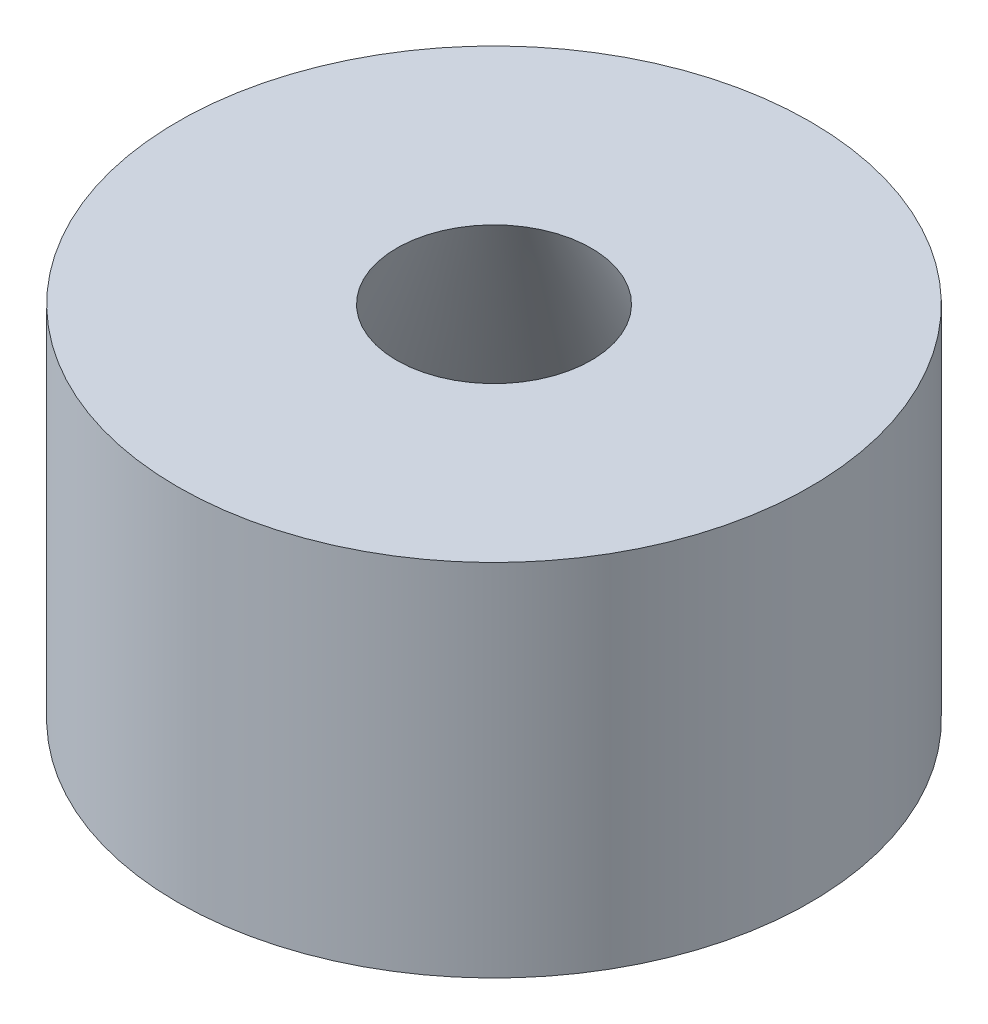
ISO-10303-21;
HEADER;
FILE_DESCRIPTION(('STEP AP214'),'2;1');
FILE_NAME('part.step','',(''),(''),'','','');
FILE_SCHEMA(('AUTOMOTIVE_DESIGN { 1 0 10303 214 1 1 1 1 }'));
ENDSEC;
DATA;
#1=APPLICATION_CONTEXT('core data for automotive mechanical design processes');
#2=APPLICATION_PROTOCOL_DEFINITION('international standard','automotive_design',2000,#1);
#3=PRODUCT_CONTEXT('',#1,'mechanical');
#4=PRODUCT('Part','Part','',(#3));
#5=PRODUCT_RELATED_PRODUCT_CATEGORY('part','',(#4));
#6=PRODUCT_DEFINITION_FORMATION('','',#4);
#7=PRODUCT_DEFINITION_CONTEXT('part definition',#1,'design');
#8=PRODUCT_DEFINITION('design','',#6,#7);
#9=PRODUCT_DEFINITION_SHAPE('','',#8);
#10=(LENGTH_UNIT() NAMED_UNIT(*) SI_UNIT(.MILLI.,.METRE.));
#11=(NAMED_UNIT(*) PLANE_ANGLE_UNIT() SI_UNIT($,.RADIAN.));
#12=(NAMED_UNIT(*) SI_UNIT($,.STERADIAN.) SOLID_ANGLE_UNIT());
#13=UNCERTAINTY_MEASURE_WITH_UNIT(LENGTH_MEASURE(1.E-05),#10,'distance_accuracy_value','');
#14=(GEOMETRIC_REPRESENTATION_CONTEXT(3) GLOBAL_UNCERTAINTY_ASSIGNED_CONTEXT((#13)) GLOBAL_UNIT_ASSIGNED_CONTEXT((#10,
#11,#12)) REPRESENTATION_CONTEXT('',''));
#15=CARTESIAN_POINT('',(0.,0.,0.));
#16=DIRECTION('',(0.,0.,1.));
#17=DIRECTION('',(1.,0.,0.));
#18=AXIS2_PLACEMENT_3D('',#15,#16,#17);
#19=CARTESIAN_POINT('',(0.,10.,0.));
#20=DIRECTION('',(0.,1.,0.));
#21=DIRECTION('',(0.,0.,1.));
#22=AXIS2_PLACEMENT_3D('',#19,#20,#21);
#23=PLANE('',#22);
#24=CARTESIAN_POINT('',(0.,10.,0.));
#25=DIRECTION('',(0.,1.,0.));
#26=DIRECTION('',(0.,0.,1.));
#27=AXIS2_PLACEMENT_3D('',#24,#25,#26);
#28=CIRCLE('',#27,8.79);
#29=CARTESIAN_POINT('',(0.,10.,8.79));
#30=VERTEX_POINT('',#29);
#31=EDGE_CURVE('E10',#30,#30,#28,.T.);
#32=ORIENTED_EDGE('',*,*,#31,.T.);
#33=EDGE_LOOP('',(#32));
#34=FACE_BOUND('',#33,.T.);
#35=CARTESIAN_POINT('',(0.,10.,0.));
#36=DIRECTION('',(0.,1.,0.));
#37=DIRECTION('',(0.,0.,1.));
#38=AXIS2_PLACEMENT_3D('',#35,#36,#37);
#39=CIRCLE('',#38,2.70267406734138);
#40=CARTESIAN_POINT('',(0.,10.,2.70267406734138));
#41=VERTEX_POINT('',#40);
#42=EDGE_CURVE('E34',#41,#41,#39,.T.);
#43=ORIENTED_EDGE('',*,*,#42,.F.);
#44=EDGE_LOOP('',(#43));
#45=FACE_BOUND('',#44,.T.);
#46=ADVANCED_FACE('F30',(#34,#45),#23,.T.);
#47=CARTESIAN_POINT('',(0.,0.,0.));
#48=DIRECTION('',(0.,1.,0.));
#49=DIRECTION('',(0.,0.,1.));
#50=AXIS2_PLACEMENT_3D('',#47,#48,#49);
#51=PLANE('',#50);
#52=CARTESIAN_POINT('',(0.,0.,0.));
#53=DIRECTION('',(0.,1.,0.));
#54=DIRECTION('',(0.,0.,1.));
#55=AXIS2_PLACEMENT_3D('',#52,#53,#54);
#56=CIRCLE('',#55,8.79);
#57=CARTESIAN_POINT('',(0.,0.,8.79));
#58=VERTEX_POINT('',#57);
#59=EDGE_CURVE('E38',#58,#58,#56,.T.);
#60=ORIENTED_EDGE('',*,*,#59,.F.);
#61=EDGE_LOOP('',(#60));
#62=FACE_BOUND('',#61,.T.);
#63=CARTESIAN_POINT('',(0.,0.,0.));
#64=DIRECTION('',(0.,1.,0.));
#65=DIRECTION('',(0.,0.,1.));
#66=AXIS2_PLACEMENT_3D('',#63,#64,#65);
#67=CIRCLE('',#66,7.579999953);
#68=CARTESIAN_POINT('',(0.,0.,7.579999953));
#69=VERTEX_POINT('',#68);
#70=EDGE_CURVE('E44',#69,#69,#67,.T.);
#71=ORIENTED_EDGE('',*,*,#70,.T.);
#72=EDGE_LOOP('',(#71));
#73=FACE_BOUND('',#72,.T.);
#74=ADVANCED_FACE('F54',(#62,#73),#51,.F.);
#75=CARTESIAN_POINT('',(0.,10.,0.));
#76=DIRECTION('',(0.,-1.,0.));
#77=DIRECTION('',(0.,0.,-1.));
#78=AXIS2_PLACEMENT_3D('',#75,#76,#77);
#79=CYLINDRICAL_SURFACE('',#78,8.79);
#80=ORIENTED_EDGE('',*,*,#31,.F.);
#81=EDGE_LOOP('',(#80));
#82=FACE_BOUND('',#81,.T.);
#83=ORIENTED_EDGE('',*,*,#59,.T.);
#84=EDGE_LOOP('',(#83));
#85=FACE_BOUND('',#84,.T.);
#86=ADVANCED_FACE('F59',(#82,#85),#79,.T.);
#87=CARTESIAN_POINT('',(0.,0.,0.));
#88=DIRECTION('',(0.,-1.,0.));
#89=DIRECTION('',(0.,0.,1.));
#90=AXIS2_PLACEMENT_3D('',#87,#88,#89);
#91=CONICAL_SURFACE('',#90,7.579999953,0.453785605518526);
#92=ORIENTED_EDGE('',*,*,#42,.T.);
#93=EDGE_LOOP('',(#92));
#94=FACE_BOUND('',#93,.T.);
#95=ORIENTED_EDGE('',*,*,#70,.F.);
#96=EDGE_LOOP('',(#95));
#97=FACE_BOUND('',#96,.T.);
#98=ADVANCED_FACE('F32',(#94,#97),#91,.F.);
#99=CLOSED_SHELL('',(#46,#74,#86,#98));
#100=MANIFOLD_SOLID_BREP('B2',#99);
#101=ADVANCED_BREP_SHAPE_REPRESENTATION('',(#18,#100),#14);
#102=SHAPE_DEFINITION_REPRESENTATION(#9,#101);
ENDSEC;
END-ISO-10303-21;
